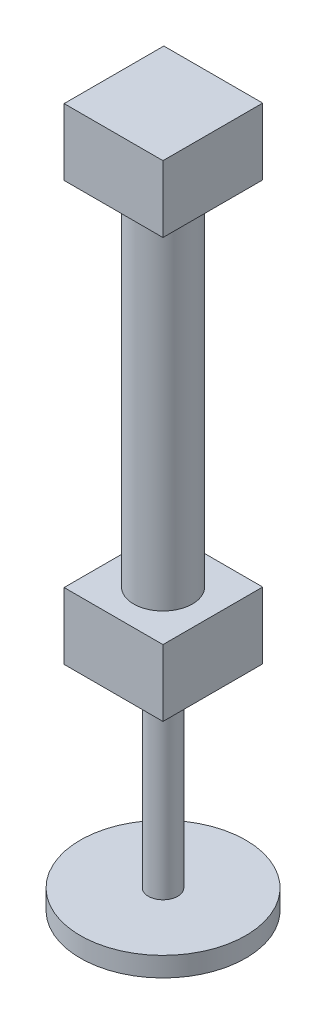
ISO-10303-21;
HEADER;
FILE_DESCRIPTION(('STEP AP214'),'2;1');
FILE_NAME('part.step','',(''),(''),'','','');
FILE_SCHEMA(('AUTOMOTIVE_DESIGN { 1 0 10303 214 1 1 1 1 }'));
ENDSEC;
DATA;
#1=APPLICATION_CONTEXT('core data for automotive mechanical design processes');
#2=APPLICATION_PROTOCOL_DEFINITION('international standard','automotive_design',2000,#1);
#3=PRODUCT_CONTEXT('',#1,'mechanical');
#4=PRODUCT('Part','Part','',(#3));
#5=PRODUCT_RELATED_PRODUCT_CATEGORY('part','',(#4));
#6=PRODUCT_DEFINITION_FORMATION('','',#4);
#7=PRODUCT_DEFINITION_CONTEXT('part definition',#1,'design');
#8=PRODUCT_DEFINITION('design','',#6,#7);
#9=PRODUCT_DEFINITION_SHAPE('','',#8);
#10=(LENGTH_UNIT() NAMED_UNIT(*) SI_UNIT(.MILLI.,.METRE.));
#11=(NAMED_UNIT(*) PLANE_ANGLE_UNIT() SI_UNIT($,.RADIAN.));
#12=(NAMED_UNIT(*) SI_UNIT($,.STERADIAN.) SOLID_ANGLE_UNIT());
#13=UNCERTAINTY_MEASURE_WITH_UNIT(LENGTH_MEASURE(1.E-05),#10,'distance_accuracy_value','');
#14=(GEOMETRIC_REPRESENTATION_CONTEXT(3) GLOBAL_UNCERTAINTY_ASSIGNED_CONTEXT((#13)) GLOBAL_UNIT_ASSIGNED_CONTEXT((#10,
#11,#12)) REPRESENTATION_CONTEXT('',''));
#15=CARTESIAN_POINT('',(0.,0.,0.));
#16=DIRECTION('',(0.,0.,1.));
#17=DIRECTION('',(1.,0.,0.));
#18=AXIS2_PLACEMENT_3D('',#15,#16,#17);
#19=CARTESIAN_POINT('',(0.,194.,0.));
#20=DIRECTION('',(0.,-1.,0.));
#21=DIRECTION('',(0.,0.,-1.));
#22=AXIS2_PLACEMENT_3D('',#19,#20,#21);
#23=CYLINDRICAL_SURFACE('',#22,15.);
#24=CARTESIAN_POINT('',(0.,180.,0.));
#25=DIRECTION('',(0.,-1.,0.));
#26=DIRECTION('',(0.,0.,-1.));
#27=AXIS2_PLACEMENT_3D('',#24,#25,#26);
#28=CIRCLE('',#27,15.);
#29=CARTESIAN_POINT('',(0.,180.,-15.));
#30=VERTEX_POINT('',#29);
#31=EDGE_CURVE('E131',#30,#30,#28,.T.);
#32=ORIENTED_EDGE('',*,*,#31,.T.);
#33=EDGE_LOOP('',(#32));
#34=FACE_BOUND('',#33,.T.);
#35=CARTESIAN_POINT('',(0.,0.,0.));
#36=DIRECTION('',(0.,1.,0.));
#37=DIRECTION('',(0.,0.,1.));
#38=AXIS2_PLACEMENT_3D('',#35,#36,#37);
#39=CIRCLE('',#38,15.);
#40=CARTESIAN_POINT('',(0.,0.,15.));
#41=VERTEX_POINT('',#40);
#42=EDGE_CURVE('E53',#41,#41,#39,.T.);
#43=ORIENTED_EDGE('',*,*,#42,.T.);
#44=EDGE_LOOP('',(#43));
#45=FACE_BOUND('',#44,.T.);
#46=ADVANCED_FACE('F45',(#34,#45),#23,.T.);
#47=CARTESIAN_POINT('',(-25.0619621250989,-34.0000000000001,-25.4576773165471));
#48=DIRECTION('',(1.,0.,0.));
#49=DIRECTION('',(0.,0.,-1.));
#50=AXIS2_PLACEMENT_3D('',#47,#48,#49);
#51=PLANE('',#50);
#52=DIRECTION('',(0.,0.,-1.));
#53=VECTOR('',#52,1.);
#54=CARTESIAN_POINT('',(-25.0619621250989,0.,-25.4576773165471));
#55=LINE('',#54,#53);
#56=CARTESIAN_POINT('',(-25.0619621250989,0.,25.4576773165485));
#57=VERTEX_POINT('',#56);
#58=CARTESIAN_POINT('',(-25.0619621250989,0.,-25.4576773165471));
#59=VERTEX_POINT('',#58);
#60=EDGE_CURVE('E172',#57,#59,#55,.T.);
#61=ORIENTED_EDGE('',*,*,#60,.T.);
#62=DIRECTION('',(0.,1.,0.));
#63=VECTOR('',#62,1.);
#64=CARTESIAN_POINT('',(-25.0619621250989,-34.0000000000001,-25.4576773165471));
#65=LINE('',#64,#63);
#66=CARTESIAN_POINT('',(-25.0619621250989,-34.0000000000001,-25.4576773165471));
#67=VERTEX_POINT('',#66);
#68=EDGE_CURVE('E184',#67,#59,#65,.T.);
#69=ORIENTED_EDGE('',*,*,#68,.F.);
#70=DIRECTION('',(0.,0.,-1.));
#71=VECTOR('',#70,1.);
#72=CARTESIAN_POINT('',(-25.0619621250989,-34.0000000000001,-25.4576773165471));
#73=LINE('',#72,#71);
#74=CARTESIAN_POINT('',(-25.0619621250989,-34.0000000000001,25.4576773165485));
#75=VERTEX_POINT('',#74);
#76=EDGE_CURVE('E165',#75,#67,#73,.T.);
#77=ORIENTED_EDGE('',*,*,#76,.F.);
#78=DIRECTION('',(0.,1.,0.));
#79=VECTOR('',#78,1.);
#80=CARTESIAN_POINT('',(-25.0619621250989,-34.0000000000001,25.4576773165485));
#81=LINE('',#80,#79);
#82=EDGE_CURVE('E171',#75,#57,#81,.T.);
#83=ORIENTED_EDGE('',*,*,#82,.T.);
#84=EDGE_LOOP('',(#61,#69,#77,#83));
#85=FACE_BOUND('',#84,.T.);
#86=ADVANCED_FACE('F212',(#85),#51,.F.);
#87=CARTESIAN_POINT('',(-25.0619621250989,-34.0000000000001,-25.4576773165471));
#88=DIRECTION('',(0.,0.,1.));
#89=DIRECTION('',(1.,0.,0.));
#90=AXIS2_PLACEMENT_3D('',#87,#88,#89);
#91=PLANE('',#90);
#92=DIRECTION('',(1.,0.,0.));
#93=VECTOR('',#92,1.);
#94=CARTESIAN_POINT('',(-25.0619621250989,0.,-25.4576773165471));
#95=LINE('',#94,#93);
#96=CARTESIAN_POINT('',(25.4137089619424,0.,-25.4576773165471));
#97=VERTEX_POINT('',#96);
#98=EDGE_CURVE('E175',#59,#97,#95,.T.);
#99=ORIENTED_EDGE('',*,*,#98,.T.);
#100=DIRECTION('',(0.,1.,0.));
#101=VECTOR('',#100,1.);
#102=CARTESIAN_POINT('',(25.4137089619424,-34.0000000000001,-25.4576773165471));
#103=LINE('',#102,#101);
#104=CARTESIAN_POINT('',(25.4137089619424,-34.0000000000001,-25.4576773165471));
#105=VERTEX_POINT('',#104);
#106=EDGE_CURVE('E182',#105,#97,#103,.T.);
#107=ORIENTED_EDGE('',*,*,#106,.F.);
#108=DIRECTION('',(1.,0.,0.));
#109=VECTOR('',#108,1.);
#110=CARTESIAN_POINT('',(-25.0619621250989,-34.0000000000001,-25.4576773165471));
#111=LINE('',#110,#109);
#112=EDGE_CURVE('E93',#67,#105,#111,.T.);
#113=ORIENTED_EDGE('',*,*,#112,.F.);
#114=ORIENTED_EDGE('',*,*,#68,.T.);
#115=EDGE_LOOP('',(#99,#107,#113,#114));
#116=FACE_BOUND('',#115,.T.);
#117=ADVANCED_FACE('F216',(#116),#91,.F.);
#118=CARTESIAN_POINT('',(25.4137089619424,-34.0000000000001,-25.4576773165471));
#119=DIRECTION('',(-1.,0.,0.));
#120=DIRECTION('',(0.,0.,1.));
#121=AXIS2_PLACEMENT_3D('',#118,#119,#120);
#122=PLANE('',#121);
#123=DIRECTION('',(0.,0.,1.));
#124=VECTOR('',#123,1.);
#125=CARTESIAN_POINT('',(25.4137089619424,0.,-25.4576773165471));
#126=LINE('',#125,#124);
#127=CARTESIAN_POINT('',(25.4137089619424,0.,25.4576773165485));
#128=VERTEX_POINT('',#127);
#129=EDGE_CURVE('E79',#97,#128,#126,.T.);
#130=ORIENTED_EDGE('',*,*,#129,.T.);
#131=DIRECTION('',(0.,1.,0.));
#132=VECTOR('',#131,1.);
#133=CARTESIAN_POINT('',(25.4137089619424,-34.0000000000001,25.4576773165485));
#134=LINE('',#133,#132);
#135=CARTESIAN_POINT('',(25.4137089619424,-34.0000000000001,25.4576773165485));
#136=VERTEX_POINT('',#135);
#137=EDGE_CURVE('E180',#136,#128,#134,.T.);
#138=ORIENTED_EDGE('',*,*,#137,.F.);
#139=DIRECTION('',(0.,0.,1.));
#140=VECTOR('',#139,1.);
#141=CARTESIAN_POINT('',(25.4137089619424,-34.0000000000001,-25.4576773165471));
#142=LINE('',#141,#140);
#143=EDGE_CURVE('E168',#105,#136,#142,.T.);
#144=ORIENTED_EDGE('',*,*,#143,.F.);
#145=ORIENTED_EDGE('',*,*,#106,.T.);
#146=EDGE_LOOP('',(#130,#138,#144,#145));
#147=FACE_BOUND('',#146,.T.);
#148=ADVANCED_FACE('F221',(#147),#122,.F.);
#149=CARTESIAN_POINT('',(-25.0619621250989,-34.0000000000001,25.4576773165485));
#150=DIRECTION('',(0.,0.,-1.));
#151=DIRECTION('',(-1.,0.,0.));
#152=AXIS2_PLACEMENT_3D('',#149,#150,#151);
#153=PLANE('',#152);
#154=DIRECTION('',(-1.,0.,0.));
#155=VECTOR('',#154,1.);
#156=CARTESIAN_POINT('',(-25.0619621250989,0.,25.4576773165485));
#157=LINE('',#156,#155);
#158=EDGE_CURVE('E85',#128,#57,#157,.T.);
#159=ORIENTED_EDGE('',*,*,#158,.T.);
#160=ORIENTED_EDGE('',*,*,#82,.F.);
#161=DIRECTION('',(-1.,0.,0.));
#162=VECTOR('',#161,1.);
#163=CARTESIAN_POINT('',(-25.0619621250989,-34.0000000000001,25.4576773165485));
#164=LINE('',#163,#162);
#165=EDGE_CURVE('E61',#136,#75,#164,.T.);
#166=ORIENTED_EDGE('',*,*,#165,.F.);
#167=ORIENTED_EDGE('',*,*,#137,.T.);
#168=EDGE_LOOP('',(#159,#160,#166,#167));
#169=FACE_BOUND('',#168,.T.);
#170=ADVANCED_FACE('F226',(#169),#153,.F.);
#171=CARTESIAN_POINT('',(0.,-34.0000000000001,0.));
#172=DIRECTION('',(0.,1.,0.));
#173=DIRECTION('',(0.,0.,1.));
#174=AXIS2_PLACEMENT_3D('',#171,#172,#173);
#175=PLANE('',#174);
#176=CARTESIAN_POINT('',(0.,-34.0000000000001,0.));
#177=DIRECTION('',(0.,1.,0.));
#178=DIRECTION('',(0.,0.,1.));
#179=AXIS2_PLACEMENT_3D('',#176,#177,#178);
#180=CIRCLE('',#179,7.5);
#181=CARTESIAN_POINT('',(0.,-34.0000000000001,7.5));
#182=VERTEX_POINT('',#181);
#183=EDGE_CURVE('E13',#182,#182,#180,.F.);
#184=ORIENTED_EDGE('',*,*,#183,.F.);
#185=EDGE_LOOP('',(#184));
#186=FACE_BOUND('',#185,.T.);
#187=ORIENTED_EDGE('',*,*,#76,.T.);
#188=ORIENTED_EDGE('',*,*,#112,.T.);
#189=ORIENTED_EDGE('',*,*,#143,.T.);
#190=ORIENTED_EDGE('',*,*,#165,.T.);
#191=EDGE_LOOP('',(#187,#188,#189,#190));
#192=FACE_BOUND('',#191,.T.);
#193=ADVANCED_FACE('F229',(#186,#192),#175,.F.);
#194=CARTESIAN_POINT('',(0.,0.,0.));
#195=DIRECTION('',(0.,1.,0.));
#196=DIRECTION('',(0.,0.,1.));
#197=AXIS2_PLACEMENT_3D('',#194,#195,#196);
#198=PLANE('',#197);
#199=ORIENTED_EDGE('',*,*,#42,.F.);
#200=EDGE_LOOP('',(#199));
#201=FACE_BOUND('',#200,.T.);
#202=ORIENTED_EDGE('',*,*,#60,.F.);
#203=ORIENTED_EDGE('',*,*,#158,.F.);
#204=ORIENTED_EDGE('',*,*,#129,.F.);
#205=ORIENTED_EDGE('',*,*,#98,.F.);
#206=EDGE_LOOP('',(#202,#203,#204,#205));
#207=FACE_BOUND('',#206,.T.);
#208=ADVANCED_FACE('F230',(#201,#207),#198,.T.);
#209=CARTESIAN_POINT('',(-25.0619621250989,214.,-25.4576773165471));
#210=DIRECTION('',(-1.,0.,0.));
#211=DIRECTION('',(0.,0.,1.));
#212=AXIS2_PLACEMENT_3D('',#209,#210,#211);
#213=PLANE('',#212);
#214=DIRECTION('',(0.,0.,-1.));
#215=VECTOR('',#214,1.);
#216=CARTESIAN_POINT('',(-25.0619621250989,180.,-25.4576773165471));
#217=LINE('',#216,#215);
#218=CARTESIAN_POINT('',(-25.0619621250989,180.,25.4576773165485));
#219=VERTEX_POINT('',#218);
#220=CARTESIAN_POINT('',(-25.0619621250989,180.,-25.4576773165471));
#221=VERTEX_POINT('',#220);
#222=EDGE_CURVE('E126',#219,#221,#217,.T.);
#223=ORIENTED_EDGE('',*,*,#222,.F.);
#224=DIRECTION('',(0.,-1.,0.));
#225=VECTOR('',#224,1.);
#226=CARTESIAN_POINT('',(-25.0619621250989,214.,25.4576773165485));
#227=LINE('',#226,#225);
#228=CARTESIAN_POINT('',(-25.0619621250989,214.,25.4576773165485));
#229=VERTEX_POINT('',#228);
#230=EDGE_CURVE('E120',#229,#219,#227,.T.);
#231=ORIENTED_EDGE('',*,*,#230,.F.);
#232=DIRECTION('',(0.,0.,-1.));
#233=VECTOR('',#232,1.);
#234=CARTESIAN_POINT('',(-25.0619621250989,214.,-25.4576773165471));
#235=LINE('',#234,#233);
#236=CARTESIAN_POINT('',(-25.0619621250989,214.,-25.4576773165471));
#237=VERTEX_POINT('',#236);
#238=EDGE_CURVE('E123',#229,#237,#235,.T.);
#239=ORIENTED_EDGE('',*,*,#238,.T.);
#240=DIRECTION('',(0.,-1.,0.));
#241=VECTOR('',#240,1.);
#242=CARTESIAN_POINT('',(-25.0619621250989,214.,-25.4576773165471));
#243=LINE('',#242,#241);
#244=EDGE_CURVE('E151',#237,#221,#243,.T.);
#245=ORIENTED_EDGE('',*,*,#244,.T.);
#246=EDGE_LOOP('',(#223,#231,#239,#245));
#247=FACE_BOUND('',#246,.T.);
#248=ADVANCED_FACE('F122',(#247),#213,.T.);
#249=CARTESIAN_POINT('',(-25.0619621250989,214.,25.4576773165485));
#250=DIRECTION('',(0.,0.,1.));
#251=DIRECTION('',(1.,0.,0.));
#252=AXIS2_PLACEMENT_3D('',#249,#250,#251);
#253=PLANE('',#252);
#254=DIRECTION('',(-1.,0.,0.));
#255=VECTOR('',#254,1.);
#256=CARTESIAN_POINT('',(-25.0619621250989,180.,25.4576773165485));
#257=LINE('',#256,#255);
#258=CARTESIAN_POINT('',(25.4137089619424,180.,25.4576773165485));
#259=VERTEX_POINT('',#258);
#260=EDGE_CURVE('E153',#259,#219,#257,.T.);
#261=ORIENTED_EDGE('',*,*,#260,.F.);
#262=DIRECTION('',(0.,-1.,0.));
#263=VECTOR('',#262,1.);
#264=CARTESIAN_POINT('',(25.4137089619424,214.,25.4576773165485));
#265=LINE('',#264,#263);
#266=CARTESIAN_POINT('',(25.4137089619424,214.,25.4576773165485));
#267=VERTEX_POINT('',#266);
#268=EDGE_CURVE('E132',#267,#259,#265,.T.);
#269=ORIENTED_EDGE('',*,*,#268,.F.);
#270=DIRECTION('',(-1.,0.,0.));
#271=VECTOR('',#270,1.);
#272=CARTESIAN_POINT('',(-25.0619621250989,214.,25.4576773165485));
#273=LINE('',#272,#271);
#274=EDGE_CURVE('E138',#267,#229,#273,.T.);
#275=ORIENTED_EDGE('',*,*,#274,.T.);
#276=ORIENTED_EDGE('',*,*,#230,.T.);
#277=EDGE_LOOP('',(#261,#269,#275,#276));
#278=FACE_BOUND('',#277,.T.);
#279=ADVANCED_FACE('F144',(#278),#253,.T.);
#280=CARTESIAN_POINT('',(25.4137089619424,214.,-25.4576773165471));
#281=DIRECTION('',(1.,0.,0.));
#282=DIRECTION('',(0.,0.,-1.));
#283=AXIS2_PLACEMENT_3D('',#280,#281,#282);
#284=PLANE('',#283);
#285=DIRECTION('',(0.,0.,1.));
#286=VECTOR('',#285,1.);
#287=CARTESIAN_POINT('',(25.4137089619424,180.,-25.4576773165471));
#288=LINE('',#287,#286);
#289=CARTESIAN_POINT('',(25.4137089619424,180.,-25.4576773165471));
#290=VERTEX_POINT('',#289);
#291=EDGE_CURVE('E156',#290,#259,#288,.T.);
#292=ORIENTED_EDGE('',*,*,#291,.F.);
#293=DIRECTION('',(0.,-1.,0.));
#294=VECTOR('',#293,1.);
#295=CARTESIAN_POINT('',(25.4137089619424,214.,-25.4576773165471));
#296=LINE('',#295,#294);
#297=CARTESIAN_POINT('',(25.4137089619424,214.,-25.4576773165471));
#298=VERTEX_POINT('',#297);
#299=EDGE_CURVE('E162',#298,#290,#296,.T.);
#300=ORIENTED_EDGE('',*,*,#299,.F.);
#301=DIRECTION('',(0.,0.,1.));
#302=VECTOR('',#301,1.);
#303=CARTESIAN_POINT('',(25.4137089619424,214.,-25.4576773165471));
#304=LINE('',#303,#302);
#305=EDGE_CURVE('E145',#298,#267,#304,.T.);
#306=ORIENTED_EDGE('',*,*,#305,.T.);
#307=ORIENTED_EDGE('',*,*,#268,.T.);
#308=EDGE_LOOP('',(#292,#300,#306,#307));
#309=FACE_BOUND('',#308,.T.);
#310=ADVANCED_FACE('F202',(#309),#284,.T.);
#311=CARTESIAN_POINT('',(-25.0619621250989,214.,-25.4576773165471));
#312=DIRECTION('',(0.,0.,-1.));
#313=DIRECTION('',(-1.,0.,0.));
#314=AXIS2_PLACEMENT_3D('',#311,#312,#313);
#315=PLANE('',#314);
#316=DIRECTION('',(1.,0.,0.));
#317=VECTOR('',#316,1.);
#318=CARTESIAN_POINT('',(-25.0619621250989,180.,-25.4576773165471));
#319=LINE('',#318,#317);
#320=EDGE_CURVE('E142',#221,#290,#319,.T.);
#321=ORIENTED_EDGE('',*,*,#320,.F.);
#322=ORIENTED_EDGE('',*,*,#244,.F.);
#323=DIRECTION('',(1.,0.,0.));
#324=VECTOR('',#323,1.);
#325=CARTESIAN_POINT('',(-25.0619621250989,214.,-25.4576773165471));
#326=LINE('',#325,#324);
#327=EDGE_CURVE('E141',#237,#298,#326,.T.);
#328=ORIENTED_EDGE('',*,*,#327,.T.);
#329=ORIENTED_EDGE('',*,*,#299,.T.);
#330=EDGE_LOOP('',(#321,#322,#328,#329));
#331=FACE_BOUND('',#330,.T.);
#332=ADVANCED_FACE('F199',(#331),#315,.T.);
#333=CARTESIAN_POINT('',(0.,214.,0.));
#334=DIRECTION('',(0.,-1.,0.));
#335=DIRECTION('',(0.,0.,1.));
#336=AXIS2_PLACEMENT_3D('',#333,#334,#335);
#337=PLANE('',#336);
#338=ORIENTED_EDGE('',*,*,#238,.F.);
#339=ORIENTED_EDGE('',*,*,#274,.F.);
#340=ORIENTED_EDGE('',*,*,#305,.F.);
#341=ORIENTED_EDGE('',*,*,#327,.F.);
#342=EDGE_LOOP('',(#338,#339,#340,#341));
#343=FACE_BOUND('',#342,.T.);
#344=ADVANCED_FACE('F136',(#343),#337,.F.);
#345=CARTESIAN_POINT('',(0.,180.,0.));
#346=DIRECTION('',(0.,-1.,0.));
#347=DIRECTION('',(0.,0.,1.));
#348=AXIS2_PLACEMENT_3D('',#345,#346,#347);
#349=PLANE('',#348);
#350=ORIENTED_EDGE('',*,*,#31,.F.);
#351=EDGE_LOOP('',(#350));
#352=FACE_BOUND('',#351,.T.);
#353=ORIENTED_EDGE('',*,*,#222,.T.);
#354=ORIENTED_EDGE('',*,*,#320,.T.);
#355=ORIENTED_EDGE('',*,*,#291,.T.);
#356=ORIENTED_EDGE('',*,*,#260,.T.);
#357=EDGE_LOOP('',(#353,#354,#355,#356));
#358=FACE_BOUND('',#357,.T.);
#359=ADVANCED_FACE('F192',(#352,#358),#349,.T.);
#360=CARTESIAN_POINT('',(0.,-133.,0.));
#361=DIRECTION('',(0.,1.,0.));
#362=DIRECTION('',(0.,0.,1.));
#363=AXIS2_PLACEMENT_3D('',#360,#361,#362);
#364=CYLINDRICAL_SURFACE('',#363,7.5);
#365=CARTESIAN_POINT('',(0.,-133.,0.));
#366=DIRECTION('',(0.,-1.,0.));
#367=DIRECTION('',(0.,0.,-1.));
#368=AXIS2_PLACEMENT_3D('',#365,#366,#367);
#369=CIRCLE('',#368,7.5);
#370=CARTESIAN_POINT('',(0.,-133.,-7.5));
#371=VERTEX_POINT('',#370);
#372=EDGE_CURVE('E154',#371,#371,#369,.T.);
#373=ORIENTED_EDGE('',*,*,#372,.F.);
#374=EDGE_LOOP('',(#373));
#375=FACE_BOUND('',#374,.T.);
#376=ORIENTED_EDGE('',*,*,#183,.T.);
#377=EDGE_LOOP('',(#376));
#378=FACE_BOUND('',#377,.T.);
#379=ADVANCED_FACE('F195',(#375,#378),#364,.T.);
#380=CARTESIAN_POINT('',(0.,-143.,0.));
#381=DIRECTION('',(0.,1.,0.));
#382=DIRECTION('',(0.,0.,1.));
#383=AXIS2_PLACEMENT_3D('',#380,#381,#382);
#384=CYLINDRICAL_SURFACE('',#383,42.2531000960105);
#385=CARTESIAN_POINT('',(0.,-143.,0.));
#386=DIRECTION('',(0.,-1.,0.));
#387=DIRECTION('',(0.,0.,-1.));
#388=AXIS2_PLACEMENT_3D('',#385,#386,#387);
#389=CIRCLE('',#388,42.2531000960105);
#390=CARTESIAN_POINT('',(0.,-143.,-42.2531000960105));
#391=VERTEX_POINT('',#390);
#392=EDGE_CURVE('E328',#391,#391,#389,.T.);
#393=ORIENTED_EDGE('',*,*,#392,.F.);
#394=EDGE_LOOP('',(#393));
#395=FACE_BOUND('',#394,.T.);
#396=CARTESIAN_POINT('',(0.,-133.,0.));
#397=DIRECTION('',(0.,-1.,0.));
#398=DIRECTION('',(0.,0.,-1.));
#399=AXIS2_PLACEMENT_3D('',#396,#397,#398);
#400=CIRCLE('',#399,42.2531000960105);
#401=CARTESIAN_POINT('',(0.,-133.,-42.2531000960105));
#402=VERTEX_POINT('',#401);
#403=EDGE_CURVE('E326',#402,#402,#400,.T.);
#404=ORIENTED_EDGE('',*,*,#403,.T.);
#405=EDGE_LOOP('',(#404));
#406=FACE_BOUND('',#405,.T.);
#407=ADVANCED_FACE('F287',(#395,#406),#384,.T.);
#408=CARTESIAN_POINT('',(0.,-143.,0.));
#409=DIRECTION('',(0.,-1.,0.));
#410=DIRECTION('',(0.,0.,-1.));
#411=AXIS2_PLACEMENT_3D('',#408,#409,#410);
#412=PLANE('',#411);
#413=ORIENTED_EDGE('',*,*,#392,.T.);
#414=EDGE_LOOP('',(#413));
#415=FACE_BOUND('',#414,.T.);
#416=ADVANCED_FACE('F297',(#415),#412,.T.);
#417=CARTESIAN_POINT('',(0.,-133.,0.));
#418=DIRECTION('',(0.,-1.,0.));
#419=DIRECTION('',(0.,0.,-1.));
#420=AXIS2_PLACEMENT_3D('',#417,#418,#419);
#421=PLANE('',#420);
#422=ORIENTED_EDGE('',*,*,#372,.T.);
#423=EDGE_LOOP('',(#422));
#424=FACE_BOUND('',#423,.T.);
#425=ORIENTED_EDGE('',*,*,#403,.F.);
#426=EDGE_LOOP('',(#425));
#427=FACE_BOUND('',#426,.T.);
#428=ADVANCED_FACE('F307',(#424,#427),#421,.F.);
#429=CLOSED_SHELL('',(#46,#86,#117,#148,#170,#193,#208,#248,#279,#310,#332,#344,#359,#379,#407,
#416,#428));
#430=MANIFOLD_SOLID_BREP('B2',#429);
#431=ADVANCED_BREP_SHAPE_REPRESENTATION('',(#18,#430),#14);
#432=SHAPE_DEFINITION_REPRESENTATION(#9,#431);
ENDSEC;
END-ISO-10303-21;
